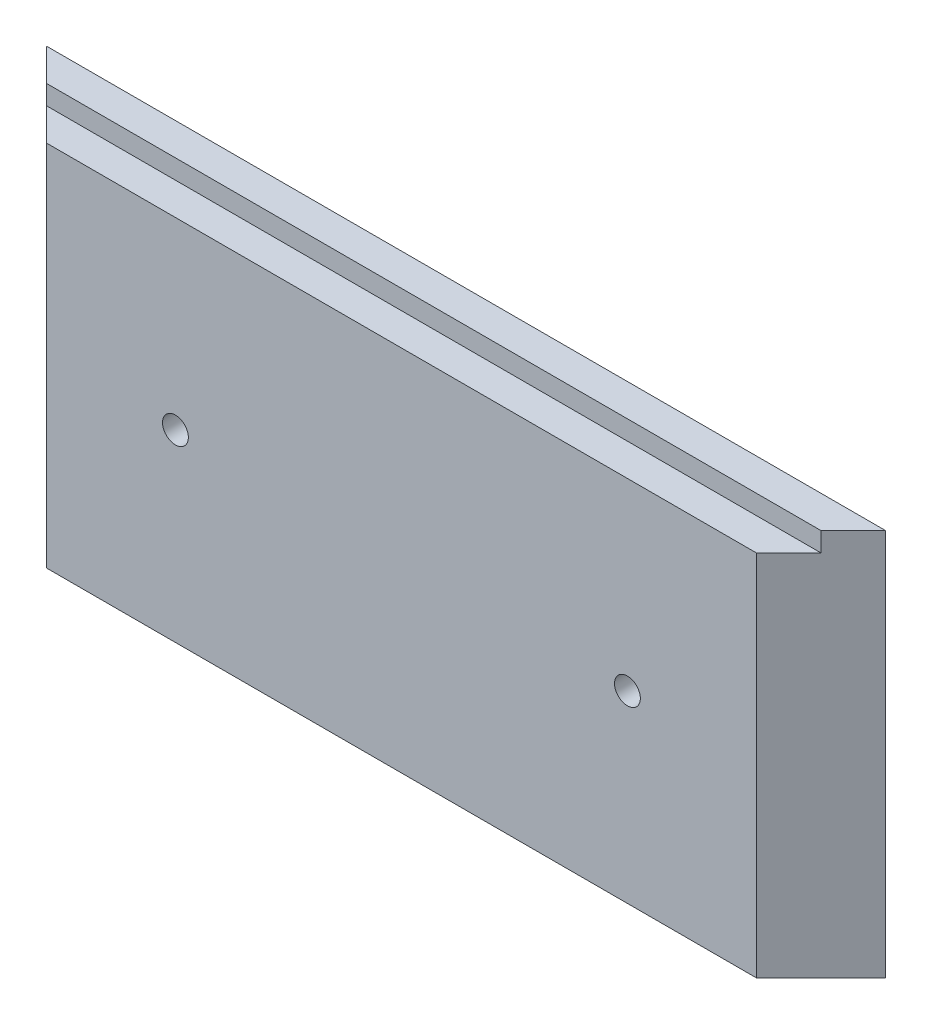
ISO-10303-21;
HEADER;
FILE_DESCRIPTION(('STEP AP214'),'2;1');
FILE_NAME('part.step','',(''),(''),'','','');
FILE_SCHEMA(('AUTOMOTIVE_DESIGN { 1 0 10303 214 1 1 1 1 }'));
ENDSEC;
DATA;
#1=APPLICATION_CONTEXT('core data for automotive mechanical design processes');
#2=APPLICATION_PROTOCOL_DEFINITION('international standard','automotive_design',2000,#1);
#3=PRODUCT_CONTEXT('',#1,'mechanical');
#4=PRODUCT('Part','Part','',(#3));
#5=PRODUCT_RELATED_PRODUCT_CATEGORY('part','',(#4));
#6=PRODUCT_DEFINITION_FORMATION('','',#4);
#7=PRODUCT_DEFINITION_CONTEXT('part definition',#1,'design');
#8=PRODUCT_DEFINITION('design','',#6,#7);
#9=PRODUCT_DEFINITION_SHAPE('','',#8);
#10=(LENGTH_UNIT() NAMED_UNIT(*) SI_UNIT(.MILLI.,.METRE.));
#11=(NAMED_UNIT(*) PLANE_ANGLE_UNIT() SI_UNIT($,.RADIAN.));
#12=(NAMED_UNIT(*) SI_UNIT($,.STERADIAN.) SOLID_ANGLE_UNIT());
#13=UNCERTAINTY_MEASURE_WITH_UNIT(LENGTH_MEASURE(1.E-05),#10,'distance_accuracy_value','');
#14=(GEOMETRIC_REPRESENTATION_CONTEXT(3) GLOBAL_UNCERTAINTY_ASSIGNED_CONTEXT((#13)) GLOBAL_UNIT_ASSIGNED_CONTEXT((#10,
#11,#12)) REPRESENTATION_CONTEXT('',''));
#15=CARTESIAN_POINT('',(0.,0.,0.));
#16=DIRECTION('',(0.,0.,1.));
#17=DIRECTION('',(1.,0.,0.));
#18=AXIS2_PLACEMENT_3D('',#15,#16,#17);
#19=CARTESIAN_POINT('',(0.,60.,0.));
#20=DIRECTION('',(0.,0.,-1.));
#21=DIRECTION('',(-1.,0.,0.));
#22=AXIS2_PLACEMENT_3D('',#19,#20,#21);
#23=PLANE('',#22);
#24=CARTESIAN_POINT('',(30.0000000000002,28.5,0.));
#25=DIRECTION('',(0.,0.,1.));
#26=DIRECTION('',(1.,0.,0.));
#27=AXIS2_PLACEMENT_3D('',#24,#25,#26);
#28=CIRCLE('',#27,2.00000000000001);
#29=CARTESIAN_POINT('',(32.0000000000002,28.5,0.));
#30=VERTEX_POINT('',#29);
#31=EDGE_CURVE('E139',#30,#30,#28,.T.);
#32=ORIENTED_EDGE('',*,*,#31,.F.);
#33=EDGE_LOOP('',(#32));
#34=FACE_BOUND('',#33,.T.);
#35=CARTESIAN_POINT('',(100.,28.5,0.));
#36=DIRECTION('',(0.,0.,1.));
#37=DIRECTION('',(1.,0.,0.));
#38=AXIS2_PLACEMENT_3D('',#35,#36,#37);
#39=CIRCLE('',#38,2.);
#40=CARTESIAN_POINT('',(102.,28.5,0.));
#41=VERTEX_POINT('',#40);
#42=EDGE_CURVE('E133',#41,#41,#39,.T.);
#43=ORIENTED_EDGE('',*,*,#42,.F.);
#44=EDGE_LOOP('',(#43));
#45=FACE_BOUND('',#44,.T.);
#46=DIRECTION('',(1.,0.,0.));
#47=VECTOR('',#46,1.);
#48=CARTESIAN_POINT('',(0.,57.,0.));
#49=LINE('',#48,#47);
#50=CARTESIAN_POINT('',(10.0000000000002,57.,0.));
#51=VERTEX_POINT('',#50);
#52=CARTESIAN_POINT('',(120.,57.,0.));
#53=VERTEX_POINT('',#52);
#54=EDGE_CURVE('E124',#51,#53,#49,.T.);
#55=ORIENTED_EDGE('',*,*,#54,.F.);
#56=DIRECTION('',(0.,-1.,0.));
#57=VECTOR('',#56,1.);
#58=CARTESIAN_POINT('',(10.0000000000002,60.,0.));
#59=LINE('',#58,#57);
#60=CARTESIAN_POINT('',(10.0000000000002,0.,0.));
#61=VERTEX_POINT('',#60);
#62=EDGE_CURVE('E88',#51,#61,#59,.T.);
#63=ORIENTED_EDGE('',*,*,#62,.T.);
#64=DIRECTION('',(1.,0.,0.));
#65=VECTOR('',#64,1.);
#66=CARTESIAN_POINT('',(0.,0.,0.));
#67=LINE('',#66,#65);
#68=CARTESIAN_POINT('',(120.,0.,0.));
#69=VERTEX_POINT('',#68);
#70=EDGE_CURVE('E92',#61,#69,#67,.T.);
#71=ORIENTED_EDGE('',*,*,#70,.T.);
#72=DIRECTION('',(0.,-1.,0.));
#73=VECTOR('',#72,1.);
#74=CARTESIAN_POINT('',(120.,60.,0.));
#75=LINE('',#74,#73);
#76=EDGE_CURVE('E78',#53,#69,#75,.T.);
#77=ORIENTED_EDGE('',*,*,#76,.F.);
#78=EDGE_LOOP('',(#55,#63,#71,#77));
#79=FACE_BOUND('',#78,.T.);
#80=ADVANCED_FACE('F35',(#34,#45,#79),#23,.F.);
#81=CARTESIAN_POINT('',(60.0000000000011,60.,60.0000000000001));
#82=DIRECTION('',(0.707106781186554,0.,0.707106781186541));
#83=DIRECTION('',(0.707106781186541,0.,-0.707106781186554));
#84=AXIS2_PLACEMENT_3D('',#81,#82,#83);
#85=PLANE('',#84);
#86=DIRECTION('',(0.,-1.,0.));
#87=VECTOR('',#86,1.);
#88=CARTESIAN_POINT('',(125.,60.000012,-5.));
#89=LINE('',#88,#87);
#90=CARTESIAN_POINT('',(125.,60.,-5.00000000000001));
#91=VERTEX_POINT('',#90);
#92=CARTESIAN_POINT('',(125.,57.,-5.));
#93=VERTEX_POINT('',#92);
#94=EDGE_CURVE('E49',#91,#93,#89,.T.);
#95=ORIENTED_EDGE('',*,*,#94,.T.);
#96=DIRECTION('',(0.707106781186541,0.,-0.707106781186554));
#97=VECTOR('',#96,1.);
#98=CARTESIAN_POINT('',(60.0000000000011,57.,60.0000000000001));
#99=LINE('',#98,#97);
#100=EDGE_CURVE('E85',#53,#93,#99,.T.);
#101=ORIENTED_EDGE('',*,*,#100,.F.);
#102=ORIENTED_EDGE('',*,*,#76,.T.);
#103=DIRECTION('',(-0.707106781186541,0.,0.707106781186554));
#104=VECTOR('',#103,1.);
#105=CARTESIAN_POINT('',(60.0000000000011,0.,60.0000000000001));
#106=LINE('',#105,#104);
#107=CARTESIAN_POINT('',(130.,0.,-10.));
#108=VERTEX_POINT('',#107);
#109=EDGE_CURVE('E81',#108,#69,#106,.T.);
#110=ORIENTED_EDGE('',*,*,#109,.F.);
#111=DIRECTION('',(0.,-1.,0.));
#112=VECTOR('',#111,1.);
#113=CARTESIAN_POINT('',(130.,60.,-10.));
#114=LINE('',#113,#112);
#115=CARTESIAN_POINT('',(130.,60.,-10.));
#116=VERTEX_POINT('',#115);
#117=EDGE_CURVE('E43',#116,#108,#114,.T.);
#118=ORIENTED_EDGE('',*,*,#117,.F.);
#119=DIRECTION('',(-0.707106781186541,0.,0.707106781186554));
#120=VECTOR('',#119,1.);
#121=CARTESIAN_POINT('',(60.0000000000011,60.,60.0000000000001));
#122=LINE('',#121,#120);
#123=EDGE_CURVE('E97',#116,#91,#122,.T.);
#124=ORIENTED_EDGE('',*,*,#123,.T.);
#125=EDGE_LOOP('',(#95,#101,#102,#110,#118,#124));
#126=FACE_BOUND('',#125,.T.);
#127=ADVANCED_FACE('F37',(#126),#85,.T.);
#128=CARTESIAN_POINT('',(0.,60.,-10.));
#129=DIRECTION('',(0.,0.,-1.));
#130=DIRECTION('',(-1.,0.,0.));
#131=AXIS2_PLACEMENT_3D('',#128,#129,#130);
#132=PLANE('',#131);
#133=DIRECTION('',(1.,0.,0.));
#134=VECTOR('',#133,1.);
#135=CARTESIAN_POINT('',(0.,0.,-10.));
#136=LINE('',#135,#134);
#137=CARTESIAN_POINT('',(0.,0.,-10.));
#138=VERTEX_POINT('',#137);
#139=EDGE_CURVE('E101',#138,#108,#136,.T.);
#140=ORIENTED_EDGE('',*,*,#139,.F.);
#141=DIRECTION('',(0.,-1.,0.));
#142=VECTOR('',#141,1.);
#143=CARTESIAN_POINT('',(0.,60.,-10.));
#144=LINE('',#143,#142);
#145=CARTESIAN_POINT('',(0.,60.,-10.));
#146=VERTEX_POINT('',#145);
#147=EDGE_CURVE('E58',#146,#138,#144,.T.);
#148=ORIENTED_EDGE('',*,*,#147,.F.);
#149=DIRECTION('',(1.,0.,0.));
#150=VECTOR('',#149,1.);
#151=CARTESIAN_POINT('',(0.,60.,-10.));
#152=LINE('',#151,#150);
#153=EDGE_CURVE('E114',#146,#116,#152,.T.);
#154=ORIENTED_EDGE('',*,*,#153,.T.);
#155=ORIENTED_EDGE('',*,*,#117,.T.);
#156=EDGE_LOOP('',(#140,#148,#154,#155));
#157=FACE_BOUND('',#156,.T.);
#158=ADVANCED_FACE('F112',(#157),#132,.T.);
#159=CARTESIAN_POINT('',(5.,60.,-5.00000000000012));
#160=DIRECTION('',(0.707106781186539,0.,-0.707106781186556));
#161=DIRECTION('',(-0.707106781186556,0.,-0.707106781186539));
#162=AXIS2_PLACEMENT_3D('',#159,#160,#161);
#163=PLANE('',#162);
#164=DIRECTION('',(0.707106781186556,0.,0.707106781186539));
#165=VECTOR('',#164,1.);
#166=CARTESIAN_POINT('',(5.,57.,-5.00000000000012));
#167=LINE('',#166,#165);
#168=CARTESIAN_POINT('',(5.00000000000012,57.,-5.));
#169=VERTEX_POINT('',#168);
#170=EDGE_CURVE('E127',#169,#51,#167,.T.);
#171=ORIENTED_EDGE('',*,*,#170,.F.);
#172=DIRECTION('',(0.,-1.,0.));
#173=VECTOR('',#172,1.);
#174=CARTESIAN_POINT('',(5.00000000000012,60.000012,-5.));
#175=LINE('',#174,#173);
#176=CARTESIAN_POINT('',(5.00000000000012,60.,-5.));
#177=VERTEX_POINT('',#176);
#178=EDGE_CURVE('E102',#177,#169,#175,.T.);
#179=ORIENTED_EDGE('',*,*,#178,.F.);
#180=DIRECTION('',(0.707106781186556,0.,0.707106781186539));
#181=VECTOR('',#180,1.);
#182=CARTESIAN_POINT('',(5.,60.,-5.00000000000012));
#183=LINE('',#182,#181);
#184=EDGE_CURVE('E89',#146,#177,#183,.T.);
#185=ORIENTED_EDGE('',*,*,#184,.F.);
#186=ORIENTED_EDGE('',*,*,#147,.T.);
#187=DIRECTION('',(0.707106781186556,0.,0.707106781186539));
#188=VECTOR('',#187,1.);
#189=CARTESIAN_POINT('',(5.,0.,-5.00000000000012));
#190=LINE('',#189,#188);
#191=EDGE_CURVE('E98',#138,#61,#190,.T.);
#192=ORIENTED_EDGE('',*,*,#191,.T.);
#193=ORIENTED_EDGE('',*,*,#62,.F.);
#194=EDGE_LOOP('',(#171,#179,#185,#186,#192,#193));
#195=FACE_BOUND('',#194,.T.);
#196=ADVANCED_FACE('F179',(#195),#163,.F.);
#197=CARTESIAN_POINT('',(0.,60.,0.));
#198=DIRECTION('',(0.,1.,0.));
#199=DIRECTION('',(0.,0.,1.));
#200=AXIS2_PLACEMENT_3D('',#197,#198,#199);
#201=PLANE('',#200);
#202=DIRECTION('',(-1.,0.,0.));
#203=VECTOR('',#202,1.);
#204=CARTESIAN_POINT('',(0.,60.,-5.));
#205=LINE('',#204,#203);
#206=EDGE_CURVE('E11',#91,#177,#205,.T.);
#207=ORIENTED_EDGE('',*,*,#206,.F.);
#208=ORIENTED_EDGE('',*,*,#123,.F.);
#209=ORIENTED_EDGE('',*,*,#153,.F.);
#210=ORIENTED_EDGE('',*,*,#184,.T.);
#211=EDGE_LOOP('',(#207,#208,#209,#210));
#212=FACE_BOUND('',#211,.T.);
#213=ADVANCED_FACE('F118',(#212),#201,.T.);
#214=CARTESIAN_POINT('',(0.,0.,0.));
#215=DIRECTION('',(0.,1.,0.));
#216=DIRECTION('',(0.,0.,1.));
#217=AXIS2_PLACEMENT_3D('',#214,#215,#216);
#218=PLANE('',#217);
#219=ORIENTED_EDGE('',*,*,#109,.T.);
#220=ORIENTED_EDGE('',*,*,#70,.F.);
#221=ORIENTED_EDGE('',*,*,#191,.F.);
#222=ORIENTED_EDGE('',*,*,#139,.T.);
#223=EDGE_LOOP('',(#219,#220,#221,#222));
#224=FACE_BOUND('',#223,.T.);
#225=ADVANCED_FACE('F100',(#224),#218,.F.);
#226=CARTESIAN_POINT('',(0.,60.000012,-5.));
#227=DIRECTION('',(0.,0.,-1.));
#228=DIRECTION('',(-1.,0.,0.));
#229=AXIS2_PLACEMENT_3D('',#226,#227,#228);
#230=PLANE('',#229);
#231=ORIENTED_EDGE('',*,*,#206,.T.);
#232=ORIENTED_EDGE('',*,*,#178,.T.);
#233=DIRECTION('',(1.,0.,0.));
#234=VECTOR('',#233,1.);
#235=CARTESIAN_POINT('',(0.,57.,-5.));
#236=LINE('',#235,#234);
#237=EDGE_CURVE('E130',#169,#93,#236,.T.);
#238=ORIENTED_EDGE('',*,*,#237,.T.);
#239=ORIENTED_EDGE('',*,*,#94,.F.);
#240=EDGE_LOOP('',(#231,#232,#238,#239));
#241=FACE_BOUND('',#240,.T.);
#242=ADVANCED_FACE('F170',(#241),#230,.F.);
#243=CARTESIAN_POINT('',(0.,57.,0.));
#244=DIRECTION('',(0.,1.,0.));
#245=DIRECTION('',(0.,0.,1.));
#246=AXIS2_PLACEMENT_3D('',#243,#244,#245);
#247=PLANE('',#246);
#248=ORIENTED_EDGE('',*,*,#237,.F.);
#249=ORIENTED_EDGE('',*,*,#170,.T.);
#250=ORIENTED_EDGE('',*,*,#54,.T.);
#251=ORIENTED_EDGE('',*,*,#100,.T.);
#252=EDGE_LOOP('',(#248,#249,#250,#251));
#253=FACE_BOUND('',#252,.T.);
#254=ADVANCED_FACE('F161',(#253),#247,.T.);
#255=CARTESIAN_POINT('',(100.,28.5,-4.));
#256=DIRECTION('',(0.,0.,1.));
#257=DIRECTION('',(1.,0.,0.));
#258=AXIS2_PLACEMENT_3D('',#255,#256,#257);
#259=CYLINDRICAL_SURFACE('',#258,2.);
#260=CARTESIAN_POINT('',(100.,28.5,-4.));
#261=DIRECTION('',(0.,0.,1.));
#262=DIRECTION('',(1.,0.,0.));
#263=AXIS2_PLACEMENT_3D('',#260,#261,#262);
#264=CIRCLE('',#263,2.);
#265=CARTESIAN_POINT('',(102.,28.5,-4.));
#266=VERTEX_POINT('',#265);
#267=EDGE_CURVE('E136',#266,#266,#264,.T.);
#268=ORIENTED_EDGE('',*,*,#267,.F.);
#269=EDGE_LOOP('',(#268));
#270=FACE_BOUND('',#269,.T.);
#271=ORIENTED_EDGE('',*,*,#42,.T.);
#272=EDGE_LOOP('',(#271));
#273=FACE_BOUND('',#272,.T.);
#274=ADVANCED_FACE('F159',(#270,#273),#259,.F.);
#275=CARTESIAN_POINT('',(100.,28.5,-4.));
#276=DIRECTION('',(0.,0.,1.));
#277=DIRECTION('',(1.,0.,0.));
#278=AXIS2_PLACEMENT_3D('',#275,#276,#277);
#279=PLANE('',#278);
#280=ORIENTED_EDGE('',*,*,#267,.T.);
#281=EDGE_LOOP('',(#280));
#282=FACE_BOUND('',#281,.T.);
#283=ADVANCED_FACE('F150',(#282),#279,.T.);
#284=CARTESIAN_POINT('',(30.0000000000002,28.5,-4.));
#285=DIRECTION('',(0.,0.,1.));
#286=DIRECTION('',(1.,0.,0.));
#287=AXIS2_PLACEMENT_3D('',#284,#285,#286);
#288=CYLINDRICAL_SURFACE('',#287,2.00000000000001);
#289=CARTESIAN_POINT('',(30.0000000000002,28.5,-4.));
#290=DIRECTION('',(0.,0.,1.));
#291=DIRECTION('',(1.,0.,0.));
#292=AXIS2_PLACEMENT_3D('',#289,#290,#291);
#293=CIRCLE('',#292,2.00000000000001);
#294=CARTESIAN_POINT('',(32.0000000000002,28.5,-4.));
#295=VERTEX_POINT('',#294);
#296=EDGE_CURVE('E132',#295,#295,#293,.T.);
#297=ORIENTED_EDGE('',*,*,#296,.F.);
#298=EDGE_LOOP('',(#297));
#299=FACE_BOUND('',#298,.T.);
#300=ORIENTED_EDGE('',*,*,#31,.T.);
#301=EDGE_LOOP('',(#300));
#302=FACE_BOUND('',#301,.T.);
#303=ADVANCED_FACE('F147',(#299,#302),#288,.F.);
#304=CARTESIAN_POINT('',(30.0000000000002,28.5,-4.));
#305=DIRECTION('',(0.,0.,1.));
#306=DIRECTION('',(1.,0.,0.));
#307=AXIS2_PLACEMENT_3D('',#304,#305,#306);
#308=PLANE('',#307);
#309=ORIENTED_EDGE('',*,*,#296,.T.);
#310=EDGE_LOOP('',(#309));
#311=FACE_BOUND('',#310,.T.);
#312=ADVANCED_FACE('F145',(#311),#308,.T.);
#313=CLOSED_SHELL('',(#80,#127,#158,#196,#213,#225,#242,#254,#274,#283,#303,#312));
#314=MANIFOLD_SOLID_BREP('B2',#313);
#315=ADVANCED_BREP_SHAPE_REPRESENTATION('',(#18,#314),#14);
#316=SHAPE_DEFINITION_REPRESENTATION(#9,#315);
ENDSEC;
END-ISO-10303-21;
